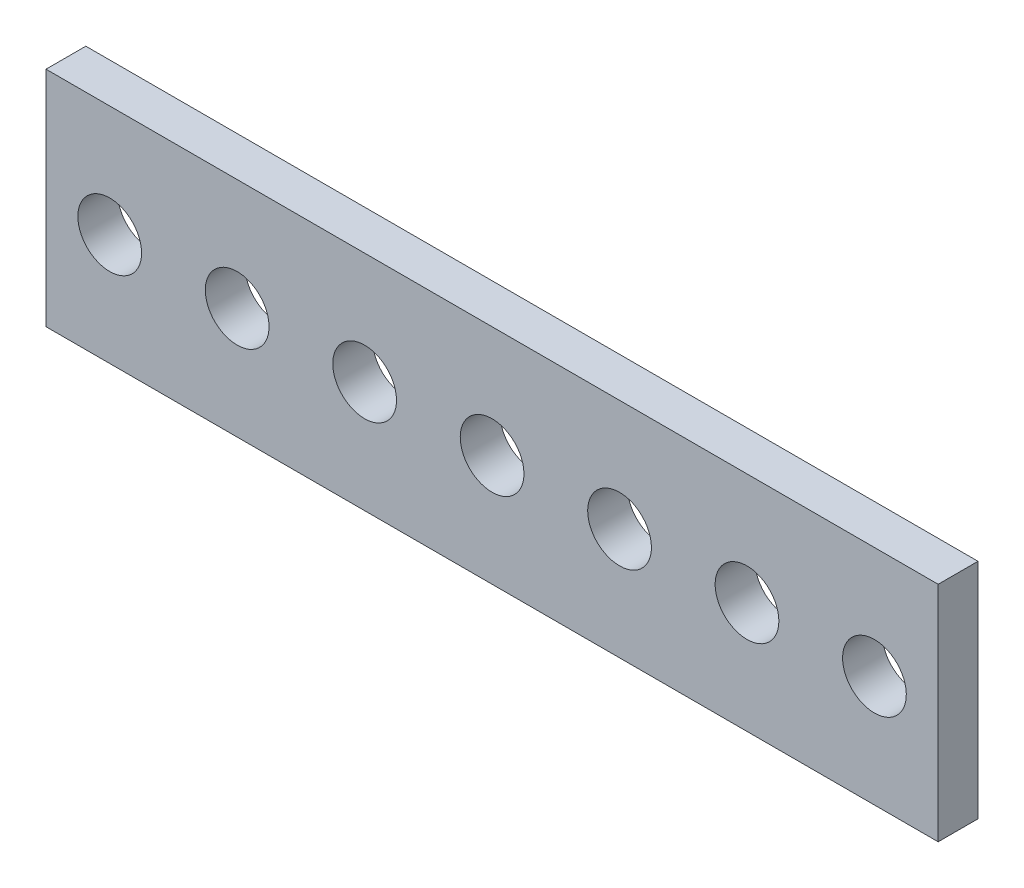
ISO-10303-21;
HEADER;
FILE_DESCRIPTION(('STEP AP214'),'2;1');
FILE_NAME('part.step','',(''),(''),'','','');
FILE_SCHEMA(('AUTOMOTIVE_DESIGN { 1 0 10303 214 1 1 1 1 }'));
ENDSEC;
DATA;
#1=APPLICATION_CONTEXT('core data for automotive mechanical design processes');
#2=APPLICATION_PROTOCOL_DEFINITION('international standard','automotive_design',2000,#1);
#3=PRODUCT_CONTEXT('',#1,'mechanical');
#4=PRODUCT('Part','Part','',(#3));
#5=PRODUCT_RELATED_PRODUCT_CATEGORY('part','',(#4));
#6=PRODUCT_DEFINITION_FORMATION('','',#4);
#7=PRODUCT_DEFINITION_CONTEXT('part definition',#1,'design');
#8=PRODUCT_DEFINITION('design','',#6,#7);
#9=PRODUCT_DEFINITION_SHAPE('','',#8);
#10=(LENGTH_UNIT() NAMED_UNIT(*) SI_UNIT(.MILLI.,.METRE.));
#11=(NAMED_UNIT(*) PLANE_ANGLE_UNIT() SI_UNIT($,.RADIAN.));
#12=(NAMED_UNIT(*) SI_UNIT($,.STERADIAN.) SOLID_ANGLE_UNIT());
#13=UNCERTAINTY_MEASURE_WITH_UNIT(LENGTH_MEASURE(1.E-05),#10,'distance_accuracy_value','');
#14=(GEOMETRIC_REPRESENTATION_CONTEXT(3) GLOBAL_UNCERTAINTY_ASSIGNED_CONTEXT((#13)) GLOBAL_UNIT_ASSIGNED_CONTEXT((#10,
#11,#12)) REPRESENTATION_CONTEXT('',''));
#15=CARTESIAN_POINT('',(0.,0.,0.));
#16=DIRECTION('',(0.,0.,1.));
#17=DIRECTION('',(1.,0.,0.));
#18=AXIS2_PLACEMENT_3D('',#15,#16,#17);
#19=CARTESIAN_POINT('',(0.,0.,0.));
#20=DIRECTION('',(0.,0.,-1.));
#21=DIRECTION('',(0.,-1.,0.));
#22=AXIS2_PLACEMENT_3D('',#19,#20,#21);
#23=PLANE('',#22);
#24=CARTESIAN_POINT('',(24.00000000001,1.00033455381322E-11,0.));
#25=DIRECTION('',(0.,0.,1.));
#26=DIRECTION('',(0.,-1.,0.));
#27=AXIS2_PLACEMENT_3D('',#24,#25,#26);
#28=CIRCLE('',#27,2.00000000001);
#29=CARTESIAN_POINT('',(24.00000000001,-2.,0.));
#30=VERTEX_POINT('',#29);
#31=EDGE_CURVE('E139',#30,#30,#28,.T.);
#32=ORIENTED_EDGE('',*,*,#31,.T.);
#33=EDGE_LOOP('',(#32));
#34=FACE_BOUND('',#33,.T.);
#35=CARTESIAN_POINT('',(16.00000000001,1.00022303587548E-11,0.));
#36=DIRECTION('',(0.,0.,1.));
#37=DIRECTION('',(0.,-1.,0.));
#38=AXIS2_PLACEMENT_3D('',#35,#36,#37);
#39=CIRCLE('',#38,2.00000000001);
#40=CARTESIAN_POINT('',(16.00000000001,-2.,0.));
#41=VERTEX_POINT('',#40);
#42=EDGE_CURVE('E125',#41,#41,#39,.T.);
#43=ORIENTED_EDGE('',*,*,#42,.T.);
#44=EDGE_LOOP('',(#43));
#45=FACE_BOUND('',#44,.T.);
#46=CARTESIAN_POINT('',(0.,0.,0.));
#47=DIRECTION('',(0.,0.,1.));
#48=DIRECTION('',(0.,-1.,0.));
#49=AXIS2_PLACEMENT_3D('',#46,#47,#48);
#50=CIRCLE('',#49,2.00000000001);
#51=CARTESIAN_POINT('',(0.,-2.00000000001,0.));
#52=VERTEX_POINT('',#51);
#53=EDGE_CURVE('E172',#52,#52,#50,.T.);
#54=ORIENTED_EDGE('',*,*,#53,.T.);
#55=EDGE_LOOP('',(#54));
#56=FACE_BOUND('',#55,.T.);
#57=CARTESIAN_POINT('',(8.00000000001,1.00011151793774E-11,0.));
#58=DIRECTION('',(0.,0.,1.));
#59=DIRECTION('',(0.,-1.,0.));
#60=AXIS2_PLACEMENT_3D('',#57,#58,#59);
#61=CIRCLE('',#60,2.00000000001);
#62=CARTESIAN_POINT('',(8.00000000001,-2.,0.));
#63=VERTEX_POINT('',#62);
#64=EDGE_CURVE('E137',#63,#63,#61,.T.);
#65=ORIENTED_EDGE('',*,*,#64,.T.);
#66=EDGE_LOOP('',(#65));
#67=FACE_BOUND('',#66,.T.);
#68=CARTESIAN_POINT('',(-24.00000000001,1.00033455381322E-11,0.));
#69=DIRECTION('',(0.,0.,-1.));
#70=DIRECTION('',(0.,-1.,0.));
#71=AXIS2_PLACEMENT_3D('',#68,#69,#70);
#72=CIRCLE('',#71,2.00000000001);
#73=CARTESIAN_POINT('',(-24.00000000001,-2.,0.));
#74=VERTEX_POINT('',#73);
#75=EDGE_CURVE('E163',#74,#74,#72,.T.);
#76=ORIENTED_EDGE('',*,*,#75,.F.);
#77=EDGE_LOOP('',(#76));
#78=FACE_BOUND('',#77,.T.);
#79=CARTESIAN_POINT('',(-16.00000000001,1.00022303587548E-11,0.));
#80=DIRECTION('',(0.,0.,-1.));
#81=DIRECTION('',(0.,-1.,0.));
#82=AXIS2_PLACEMENT_3D('',#79,#80,#81);
#83=CIRCLE('',#82,2.00000000001);
#84=CARTESIAN_POINT('',(-16.00000000001,-2.,0.));
#85=VERTEX_POINT('',#84);
#86=EDGE_CURVE('E157',#85,#85,#83,.T.);
#87=ORIENTED_EDGE('',*,*,#86,.F.);
#88=EDGE_LOOP('',(#87));
#89=FACE_BOUND('',#88,.T.);
#90=CARTESIAN_POINT('',(-8.00000000001,1.00011151793774E-11,0.));
#91=DIRECTION('',(0.,0.,-1.));
#92=DIRECTION('',(0.,-1.,0.));
#93=AXIS2_PLACEMENT_3D('',#90,#91,#92);
#94=CIRCLE('',#93,2.00000000001);
#95=CARTESIAN_POINT('',(-8.00000000001,-2.,0.));
#96=VERTEX_POINT('',#95);
#97=EDGE_CURVE('E147',#96,#96,#94,.T.);
#98=ORIENTED_EDGE('',*,*,#97,.F.);
#99=EDGE_LOOP('',(#98));
#100=FACE_BOUND('',#99,.T.);
#101=DIRECTION('',(0.,-1.,0.));
#102=VECTOR('',#101,1.);
#103=CARTESIAN_POINT('',(-28.00000000001,7.00000000001,0.));
#104=LINE('',#103,#102);
#105=CARTESIAN_POINT('',(-28.,7.,0.));
#106=VERTEX_POINT('',#105);
#107=CARTESIAN_POINT('',(-28.,-7.,0.));
#108=VERTEX_POINT('',#107);
#109=EDGE_CURVE('E167',#106,#108,#104,.T.);
#110=ORIENTED_EDGE('',*,*,#109,.F.);
#111=DIRECTION('',(-1.,0.,0.));
#112=VECTOR('',#111,1.);
#113=CARTESIAN_POINT('',(28.00000000001,7.00000000001,0.));
#114=LINE('',#113,#112);
#115=CARTESIAN_POINT('',(28.,7.,0.));
#116=VERTEX_POINT('',#115);
#117=EDGE_CURVE('E26',#116,#106,#114,.T.);
#118=ORIENTED_EDGE('',*,*,#117,.F.);
#119=DIRECTION('',(0.,1.,0.));
#120=VECTOR('',#119,1.);
#121=CARTESIAN_POINT('',(28.00000000001,7.00000000001,0.));
#122=LINE('',#121,#120);
#123=CARTESIAN_POINT('',(28.,-7.,0.));
#124=VERTEX_POINT('',#123);
#125=EDGE_CURVE('E154',#124,#116,#122,.T.);
#126=ORIENTED_EDGE('',*,*,#125,.F.);
#127=DIRECTION('',(1.,0.,0.));
#128=VECTOR('',#127,1.);
#129=CARTESIAN_POINT('',(28.00000000001,-7.00000000001,0.));
#130=LINE('',#129,#128);
#131=EDGE_CURVE('E195',#108,#124,#130,.T.);
#132=ORIENTED_EDGE('',*,*,#131,.F.);
#133=EDGE_LOOP('',(#110,#118,#126,#132));
#134=FACE_BOUND('',#133,.T.);
#135=ADVANCED_FACE('F17',(#34,#45,#56,#67,#78,#89,#100,#134),#23,.T.);
#136=CARTESIAN_POINT('',(0.,0.,2.5));
#137=DIRECTION('',(0.,0.,-1.));
#138=DIRECTION('',(0.,-1.,0.));
#139=AXIS2_PLACEMENT_3D('',#136,#137,#138);
#140=PLANE('',#139);
#141=CARTESIAN_POINT('',(24.00000000001,1.00033455381322E-11,2.50000000001));
#142=DIRECTION('',(0.,0.,1.));
#143=DIRECTION('',(0.,-1.,0.));
#144=AXIS2_PLACEMENT_3D('',#141,#142,#143);
#145=CIRCLE('',#144,2.00000000001);
#146=CARTESIAN_POINT('',(24.00000000001,-2.,2.50000000001));
#147=VERTEX_POINT('',#146);
#148=EDGE_CURVE('E166',#147,#147,#145,.T.);
#149=ORIENTED_EDGE('',*,*,#148,.F.);
#150=EDGE_LOOP('',(#149));
#151=FACE_BOUND('',#150,.T.);
#152=CARTESIAN_POINT('',(16.00000000001,1.00022303587548E-11,2.50000000001));
#153=DIRECTION('',(0.,0.,1.));
#154=DIRECTION('',(0.,-1.,0.));
#155=AXIS2_PLACEMENT_3D('',#152,#153,#154);
#156=CIRCLE('',#155,2.00000000001);
#157=CARTESIAN_POINT('',(16.00000000001,-2.,2.50000000001));
#158=VERTEX_POINT('',#157);
#159=EDGE_CURVE('E130',#158,#158,#156,.T.);
#160=ORIENTED_EDGE('',*,*,#159,.F.);
#161=EDGE_LOOP('',(#160));
#162=FACE_BOUND('',#161,.T.);
#163=CARTESIAN_POINT('',(0.,0.,2.50000000001));
#164=DIRECTION('',(0.,0.,1.));
#165=DIRECTION('',(0.,-1.,0.));
#166=AXIS2_PLACEMENT_3D('',#163,#164,#165);
#167=CIRCLE('',#166,2.00000000001);
#168=CARTESIAN_POINT('',(0.,-2.00000000001,2.50000000001));
#169=VERTEX_POINT('',#168);
#170=EDGE_CURVE('E175',#169,#169,#167,.T.);
#171=ORIENTED_EDGE('',*,*,#170,.F.);
#172=EDGE_LOOP('',(#171));
#173=FACE_BOUND('',#172,.T.);
#174=CARTESIAN_POINT('',(8.00000000001,1.00011151793774E-11,2.50000000001));
#175=DIRECTION('',(0.,0.,1.));
#176=DIRECTION('',(0.,-1.,0.));
#177=AXIS2_PLACEMENT_3D('',#174,#175,#176);
#178=CIRCLE('',#177,2.00000000001);
#179=CARTESIAN_POINT('',(8.00000000001,-2.,2.50000000001));
#180=VERTEX_POINT('',#179);
#181=EDGE_CURVE('E129',#180,#180,#178,.T.);
#182=ORIENTED_EDGE('',*,*,#181,.F.);
#183=EDGE_LOOP('',(#182));
#184=FACE_BOUND('',#183,.T.);
#185=CARTESIAN_POINT('',(-24.00000000001,1.00033455381322E-11,2.50000000001));
#186=DIRECTION('',(0.,0.,-1.));
#187=DIRECTION('',(0.,-1.,0.));
#188=AXIS2_PLACEMENT_3D('',#185,#186,#187);
#189=CIRCLE('',#188,2.00000000001);
#190=CARTESIAN_POINT('',(-24.00000000001,-2.,2.50000000001));
#191=VERTEX_POINT('',#190);
#192=EDGE_CURVE('E160',#191,#191,#189,.T.);
#193=ORIENTED_EDGE('',*,*,#192,.T.);
#194=EDGE_LOOP('',(#193));
#195=FACE_BOUND('',#194,.T.);
#196=CARTESIAN_POINT('',(-16.00000000001,1.00022303587548E-11,2.50000000001));
#197=DIRECTION('',(0.,0.,-1.));
#198=DIRECTION('',(0.,-1.,0.));
#199=AXIS2_PLACEMENT_3D('',#196,#197,#198);
#200=CIRCLE('',#199,2.00000000001);
#201=CARTESIAN_POINT('',(-16.00000000001,-2.,2.50000000001));
#202=VERTEX_POINT('',#201);
#203=EDGE_CURVE('E150',#202,#202,#200,.T.);
#204=ORIENTED_EDGE('',*,*,#203,.T.);
#205=EDGE_LOOP('',(#204));
#206=FACE_BOUND('',#205,.T.);
#207=CARTESIAN_POINT('',(-8.00000000001,1.00011151793774E-11,2.50000000001));
#208=DIRECTION('',(0.,0.,-1.));
#209=DIRECTION('',(0.,-1.,0.));
#210=AXIS2_PLACEMENT_3D('',#207,#208,#209);
#211=CIRCLE('',#210,2.00000000001);
#212=CARTESIAN_POINT('',(-8.00000000001,-2.,2.50000000001));
#213=VERTEX_POINT('',#212);
#214=EDGE_CURVE('E143',#213,#213,#211,.T.);
#215=ORIENTED_EDGE('',*,*,#214,.T.);
#216=EDGE_LOOP('',(#215));
#217=FACE_BOUND('',#216,.T.);
#218=DIRECTION('',(0.,-1.,0.));
#219=VECTOR('',#218,1.);
#220=CARTESIAN_POINT('',(-28.00000000001,7.00000000001,2.50000000001));
#221=LINE('',#220,#219);
#222=CARTESIAN_POINT('',(-28.,7.,2.5));
#223=VERTEX_POINT('',#222);
#224=CARTESIAN_POINT('',(-28.,-7.,2.5));
#225=VERTEX_POINT('',#224);
#226=EDGE_CURVE('E187',#223,#225,#221,.T.);
#227=ORIENTED_EDGE('',*,*,#226,.T.);
#228=DIRECTION('',(1.,0.,0.));
#229=VECTOR('',#228,1.);
#230=CARTESIAN_POINT('',(28.00000000001,-7.00000000001,2.50000000001));
#231=LINE('',#230,#229);
#232=CARTESIAN_POINT('',(28.,-7.,2.5));
#233=VERTEX_POINT('',#232);
#234=EDGE_CURVE('E203',#225,#233,#231,.T.);
#235=ORIENTED_EDGE('',*,*,#234,.T.);
#236=DIRECTION('',(0.,1.,0.));
#237=VECTOR('',#236,1.);
#238=CARTESIAN_POINT('',(28.00000000001,7.00000000001,2.50000000001));
#239=LINE('',#238,#237);
#240=CARTESIAN_POINT('',(28.,7.,2.5));
#241=VERTEX_POINT('',#240);
#242=EDGE_CURVE('E146',#233,#241,#239,.T.);
#243=ORIENTED_EDGE('',*,*,#242,.T.);
#244=DIRECTION('',(-1.,0.,0.));
#245=VECTOR('',#244,1.);
#246=CARTESIAN_POINT('',(28.00000000001,7.00000000001,2.50000000001));
#247=LINE('',#246,#245);
#248=EDGE_CURVE('E11',#241,#223,#247,.T.);
#249=ORIENTED_EDGE('',*,*,#248,.T.);
#250=EDGE_LOOP('',(#227,#235,#243,#249));
#251=FACE_BOUND('',#250,.T.);
#252=ADVANCED_FACE('F19',(#151,#162,#173,#184,#195,#206,#217,#251),#140,.F.);
#253=CARTESIAN_POINT('',(28.,7.,2.5));
#254=DIRECTION('',(0.,-1.,0.));
#255=DIRECTION('',(-1.,0.,0.));
#256=AXIS2_PLACEMENT_3D('',#253,#254,#255);
#257=PLANE('',#256);
#258=ORIENTED_EDGE('',*,*,#117,.T.);
#259=DIRECTION('',(0.,0.,-1.));
#260=VECTOR('',#259,1.);
#261=CARTESIAN_POINT('',(-28.00000000001,7.00000000001,2.50000000001));
#262=LINE('',#261,#260);
#263=EDGE_CURVE('E191',#223,#106,#262,.T.);
#264=ORIENTED_EDGE('',*,*,#263,.F.);
#265=ORIENTED_EDGE('',*,*,#248,.F.);
#266=DIRECTION('',(0.,0.,-1.));
#267=VECTOR('',#266,1.);
#268=CARTESIAN_POINT('',(28.00000000001,7.00000000001,2.50000000001));
#269=LINE('',#268,#267);
#270=EDGE_CURVE('E151',#241,#116,#269,.T.);
#271=ORIENTED_EDGE('',*,*,#270,.T.);
#272=EDGE_LOOP('',(#258,#264,#265,#271));
#273=FACE_BOUND('',#272,.T.);
#274=ADVANCED_FACE('F217',(#273),#257,.F.);
#275=CARTESIAN_POINT('',(28.,7.,2.5));
#276=DIRECTION('',(-1.,0.,0.));
#277=DIRECTION('',(0.,0.,1.));
#278=AXIS2_PLACEMENT_3D('',#275,#276,#277);
#279=PLANE('',#278);
#280=ORIENTED_EDGE('',*,*,#125,.T.);
#281=ORIENTED_EDGE('',*,*,#270,.F.);
#282=ORIENTED_EDGE('',*,*,#242,.F.);
#283=DIRECTION('',(0.,0.,-1.));
#284=VECTOR('',#283,1.);
#285=CARTESIAN_POINT('',(28.00000000001,-7.00000000001,2.50000000001));
#286=LINE('',#285,#284);
#287=EDGE_CURVE('E199',#233,#124,#286,.T.);
#288=ORIENTED_EDGE('',*,*,#287,.T.);
#289=EDGE_LOOP('',(#280,#281,#282,#288));
#290=FACE_BOUND('',#289,.T.);
#291=ADVANCED_FACE('F216',(#290),#279,.F.);
#292=CARTESIAN_POINT('',(28.,-7.,2.5));
#293=DIRECTION('',(0.,1.,0.));
#294=DIRECTION('',(1.,0.,0.));
#295=AXIS2_PLACEMENT_3D('',#292,#293,#294);
#296=PLANE('',#295);
#297=ORIENTED_EDGE('',*,*,#131,.T.);
#298=ORIENTED_EDGE('',*,*,#287,.F.);
#299=ORIENTED_EDGE('',*,*,#234,.F.);
#300=DIRECTION('',(0.,0.,-1.));
#301=VECTOR('',#300,1.);
#302=CARTESIAN_POINT('',(-28.00000000001,-7.00000000001,2.50000000001));
#303=LINE('',#302,#301);
#304=EDGE_CURVE('E171',#225,#108,#303,.T.);
#305=ORIENTED_EDGE('',*,*,#304,.T.);
#306=EDGE_LOOP('',(#297,#298,#299,#305));
#307=FACE_BOUND('',#306,.T.);
#308=ADVANCED_FACE('F223',(#307),#296,.F.);
#309=CARTESIAN_POINT('',(-28.,7.,2.5));
#310=DIRECTION('',(1.,0.,0.));
#311=DIRECTION('',(0.,1.,0.));
#312=AXIS2_PLACEMENT_3D('',#309,#310,#311);
#313=PLANE('',#312);
#314=ORIENTED_EDGE('',*,*,#109,.T.);
#315=ORIENTED_EDGE('',*,*,#304,.F.);
#316=ORIENTED_EDGE('',*,*,#226,.F.);
#317=ORIENTED_EDGE('',*,*,#263,.T.);
#318=EDGE_LOOP('',(#314,#315,#316,#317));
#319=FACE_BOUND('',#318,.T.);
#320=ADVANCED_FACE('F220',(#319),#313,.F.);
#321=CARTESIAN_POINT('',(0.,0.,0.));
#322=DIRECTION('',(0.,0.,1.));
#323=DIRECTION('',(0.,-1.,0.));
#324=AXIS2_PLACEMENT_3D('',#321,#322,#323);
#325=CYLINDRICAL_SURFACE('',#324,2.);
#326=ORIENTED_EDGE('',*,*,#53,.F.);
#327=EDGE_LOOP('',(#326));
#328=FACE_BOUND('',#327,.T.);
#329=ORIENTED_EDGE('',*,*,#170,.T.);
#330=EDGE_LOOP('',(#329));
#331=FACE_BOUND('',#330,.T.);
#332=ADVANCED_FACE('F232',(#328,#331),#325,.F.);
#333=CARTESIAN_POINT('',(8.,0.,0.));
#334=DIRECTION('',(0.,0.,1.));
#335=DIRECTION('',(0.,-1.,0.));
#336=AXIS2_PLACEMENT_3D('',#333,#334,#335);
#337=CYLINDRICAL_SURFACE('',#336,2.);
#338=ORIENTED_EDGE('',*,*,#64,.F.);
#339=EDGE_LOOP('',(#338));
#340=FACE_BOUND('',#339,.T.);
#341=ORIENTED_EDGE('',*,*,#181,.T.);
#342=EDGE_LOOP('',(#341));
#343=FACE_BOUND('',#342,.T.);
#344=ADVANCED_FACE('F244',(#340,#343),#337,.F.);
#345=CARTESIAN_POINT('',(16.,0.,0.));
#346=DIRECTION('',(0.,0.,1.));
#347=DIRECTION('',(0.,-1.,0.));
#348=AXIS2_PLACEMENT_3D('',#345,#346,#347);
#349=CYLINDRICAL_SURFACE('',#348,2.);
#350=ORIENTED_EDGE('',*,*,#42,.F.);
#351=EDGE_LOOP('',(#350));
#352=FACE_BOUND('',#351,.T.);
#353=ORIENTED_EDGE('',*,*,#159,.T.);
#354=EDGE_LOOP('',(#353));
#355=FACE_BOUND('',#354,.T.);
#356=ADVANCED_FACE('F247',(#352,#355),#349,.F.);
#357=CARTESIAN_POINT('',(24.,0.,0.));
#358=DIRECTION('',(0.,0.,1.));
#359=DIRECTION('',(0.,-1.,0.));
#360=AXIS2_PLACEMENT_3D('',#357,#358,#359);
#361=CYLINDRICAL_SURFACE('',#360,2.);
#362=ORIENTED_EDGE('',*,*,#31,.F.);
#363=EDGE_LOOP('',(#362));
#364=FACE_BOUND('',#363,.T.);
#365=ORIENTED_EDGE('',*,*,#148,.T.);
#366=EDGE_LOOP('',(#365));
#367=FACE_BOUND('',#366,.T.);
#368=ADVANCED_FACE('F263',(#364,#367),#361,.F.);
#369=CARTESIAN_POINT('',(-24.,0.,0.));
#370=DIRECTION('',(0.,0.,1.));
#371=DIRECTION('',(0.,-1.,0.));
#372=AXIS2_PLACEMENT_3D('',#369,#370,#371);
#373=CYLINDRICAL_SURFACE('',#372,2.);
#374=ORIENTED_EDGE('',*,*,#75,.T.);
#375=EDGE_LOOP('',(#374));
#376=FACE_BOUND('',#375,.T.);
#377=ORIENTED_EDGE('',*,*,#192,.F.);
#378=EDGE_LOOP('',(#377));
#379=FACE_BOUND('',#378,.T.);
#380=ADVANCED_FACE('F256',(#376,#379),#373,.F.);
#381=CARTESIAN_POINT('',(-16.,0.,0.));
#382=DIRECTION('',(0.,0.,1.));
#383=DIRECTION('',(0.,-1.,0.));
#384=AXIS2_PLACEMENT_3D('',#381,#382,#383);
#385=CYLINDRICAL_SURFACE('',#384,2.);
#386=ORIENTED_EDGE('',*,*,#86,.T.);
#387=EDGE_LOOP('',(#386));
#388=FACE_BOUND('',#387,.T.);
#389=ORIENTED_EDGE('',*,*,#203,.F.);
#390=EDGE_LOOP('',(#389));
#391=FACE_BOUND('',#390,.T.);
#392=ADVANCED_FACE('F252',(#388,#391),#385,.F.);
#393=CARTESIAN_POINT('',(-8.,0.,0.));
#394=DIRECTION('',(0.,0.,1.));
#395=DIRECTION('',(0.,-1.,0.));
#396=AXIS2_PLACEMENT_3D('',#393,#394,#395);
#397=CYLINDRICAL_SURFACE('',#396,2.);
#398=ORIENTED_EDGE('',*,*,#97,.T.);
#399=EDGE_LOOP('',(#398));
#400=FACE_BOUND('',#399,.T.);
#401=ORIENTED_EDGE('',*,*,#214,.F.);
#402=EDGE_LOOP('',(#401));
#403=FACE_BOUND('',#402,.T.);
#404=ADVANCED_FACE('F249',(#400,#403),#397,.F.);
#405=CLOSED_SHELL('',(#135,#252,#274,#291,#308,#320,#332,#344,#356,#368,#380,#392,#404));
#406=MANIFOLD_SOLID_BREP('B1',#405);
#407=ADVANCED_BREP_SHAPE_REPRESENTATION('',(#18,#406),#14);
#408=SHAPE_DEFINITION_REPRESENTATION(#9,#407);
ENDSEC;
END-ISO-10303-21;
